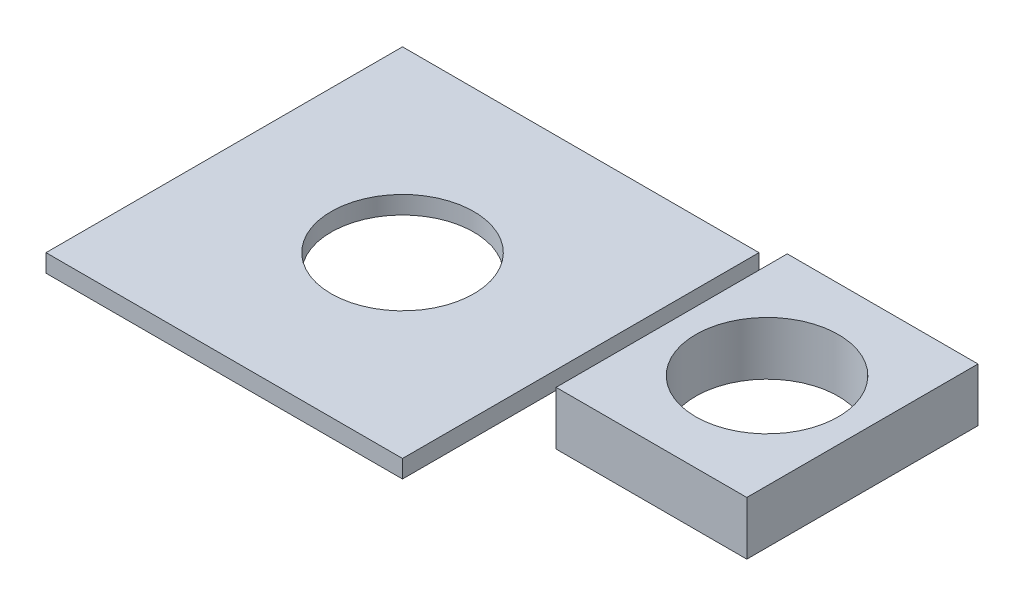
ISO-10303-21;
HEADER;
FILE_DESCRIPTION(('STEP AP214'),'2;1');
FILE_NAME('part.step','',(''),(''),'','','');
FILE_SCHEMA(('AUTOMOTIVE_DESIGN { 1 0 10303 214 1 1 1 1 }'));
ENDSEC;
DATA;
#1=APPLICATION_CONTEXT('core data for automotive mechanical design processes');
#2=APPLICATION_PROTOCOL_DEFINITION('international standard','automotive_design',2000,#1);
#3=PRODUCT_CONTEXT('',#1,'mechanical');
#4=PRODUCT('Part','Part','',(#3));
#5=PRODUCT_RELATED_PRODUCT_CATEGORY('part','',(#4));
#6=PRODUCT_DEFINITION_FORMATION('','',#4);
#7=PRODUCT_DEFINITION_CONTEXT('part definition',#1,'design');
#8=PRODUCT_DEFINITION('design','',#6,#7);
#9=PRODUCT_DEFINITION_SHAPE('','',#8);
#10=(LENGTH_UNIT() NAMED_UNIT(*) SI_UNIT(.MILLI.,.METRE.));
#11=(NAMED_UNIT(*) PLANE_ANGLE_UNIT() SI_UNIT($,.RADIAN.));
#12=(NAMED_UNIT(*) SI_UNIT($,.STERADIAN.) SOLID_ANGLE_UNIT());
#13=UNCERTAINTY_MEASURE_WITH_UNIT(LENGTH_MEASURE(1.E-05),#10,'distance_accuracy_value','');
#14=(GEOMETRIC_REPRESENTATION_CONTEXT(3) GLOBAL_UNCERTAINTY_ASSIGNED_CONTEXT((#13)) GLOBAL_UNIT_ASSIGNED_CONTEXT((#10,
#11,#12)) REPRESENTATION_CONTEXT('',''));
#15=CARTESIAN_POINT('',(0.,0.,0.));
#16=DIRECTION('',(0.,0.,1.));
#17=DIRECTION('',(1.,0.,0.));
#18=AXIS2_PLACEMENT_3D('',#15,#16,#17);
#19=CARTESIAN_POINT('',(0.,1.,0.));
#20=DIRECTION('',(0.,1.,0.));
#21=DIRECTION('',(0.,0.,1.));
#22=AXIS2_PLACEMENT_3D('',#19,#20,#21);
#23=PLANE('',#22);
#24=DIRECTION('',(0.,0.,-1.));
#25=VECTOR('',#24,1.);
#26=CARTESIAN_POINT('',(-8.20172779817295,1.,-7.75070162097188));
#27=LINE('',#26,#25);
#28=CARTESIAN_POINT('',(-8.20172779817295,1.,12.2492983790281));
#29=VERTEX_POINT('',#28);
#30=CARTESIAN_POINT('',(-8.20172779817295,1.,-7.75070162097188));
#31=VERTEX_POINT('',#30);
#32=EDGE_CURVE('E101',#29,#31,#27,.T.);
#33=ORIENTED_EDGE('',*,*,#32,.T.);
#34=DIRECTION('',(-1.,0.,0.));
#35=VECTOR('',#34,1.);
#36=CARTESIAN_POINT('',(-28.201727798173,1.,-7.75070162097188));
#37=LINE('',#36,#35);
#38=CARTESIAN_POINT('',(-28.201727798173,1.,-7.75070162097188));
#39=VERTEX_POINT('',#38);
#40=EDGE_CURVE('E96',#31,#39,#37,.T.);
#41=ORIENTED_EDGE('',*,*,#40,.T.);
#42=DIRECTION('',(0.,0.,1.));
#43=VECTOR('',#42,1.);
#44=CARTESIAN_POINT('',(-28.201727798173,1.,-7.75070162097188));
#45=LINE('',#44,#43);
#46=CARTESIAN_POINT('',(-28.2017277981729,1.,12.2492983790281));
#47=VERTEX_POINT('',#46);
#48=EDGE_CURVE('E99',#39,#47,#45,.T.);
#49=ORIENTED_EDGE('',*,*,#48,.T.);
#50=DIRECTION('',(1.,0.,0.));
#51=VECTOR('',#50,1.);
#52=CARTESIAN_POINT('',(-28.2017277981729,1.,12.2492983790281));
#53=LINE('',#52,#51);
#54=EDGE_CURVE('E66',#47,#29,#53,.T.);
#55=ORIENTED_EDGE('',*,*,#54,.T.);
#56=EDGE_LOOP('',(#33,#41,#49,#55));
#57=FACE_BOUND('',#56,.T.);
#58=CARTESIAN_POINT('',(-18.201727798173,1.,2.24929837902812));
#59=DIRECTION('',(0.,1.,0.));
#60=DIRECTION('',(0.,0.,1.));
#61=AXIS2_PLACEMENT_3D('',#58,#59,#60);
#62=CIRCLE('',#61,4.);
#63=CARTESIAN_POINT('',(-18.201727798173,1.,6.24929837902812));
#64=VERTEX_POINT('',#63);
#65=EDGE_CURVE('E116',#64,#64,#62,.T.);
#66=ORIENTED_EDGE('',*,*,#65,.F.);
#67=EDGE_LOOP('',(#66));
#68=FACE_BOUND('',#67,.T.);
#69=ADVANCED_FACE('F49',(#57,#68),#23,.T.);
#70=CARTESIAN_POINT('',(0.,0.,0.));
#71=DIRECTION('',(0.,1.,0.));
#72=DIRECTION('',(0.,0.,1.));
#73=AXIS2_PLACEMENT_3D('',#70,#71,#72);
#74=PLANE('',#73);
#75=DIRECTION('',(0.,0.,-1.));
#76=VECTOR('',#75,1.);
#77=CARTESIAN_POINT('',(-8.20172779817295,0.,-7.75070162097188));
#78=LINE('',#77,#76);
#79=CARTESIAN_POINT('',(-8.20172779817295,0.,12.2492983790281));
#80=VERTEX_POINT('',#79);
#81=CARTESIAN_POINT('',(-8.20172779817295,0.,-7.75070162097188));
#82=VERTEX_POINT('',#81);
#83=EDGE_CURVE('E113',#80,#82,#78,.T.);
#84=ORIENTED_EDGE('',*,*,#83,.F.);
#85=DIRECTION('',(1.,0.,0.));
#86=VECTOR('',#85,1.);
#87=CARTESIAN_POINT('',(-28.2017277981729,0.,12.2492983790281));
#88=LINE('',#87,#86);
#89=CARTESIAN_POINT('',(-28.2017277981729,0.,12.2492983790281));
#90=VERTEX_POINT('',#89);
#91=EDGE_CURVE('E89',#90,#80,#88,.T.);
#92=ORIENTED_EDGE('',*,*,#91,.F.);
#93=DIRECTION('',(0.,0.,1.));
#94=VECTOR('',#93,1.);
#95=CARTESIAN_POINT('',(-28.201727798173,0.,-7.75070162097188));
#96=LINE('',#95,#94);
#97=CARTESIAN_POINT('',(-28.201727798173,0.,-7.75070162097188));
#98=VERTEX_POINT('',#97);
#99=EDGE_CURVE('E83',#98,#90,#96,.T.);
#100=ORIENTED_EDGE('',*,*,#99,.F.);
#101=DIRECTION('',(-1.,0.,0.));
#102=VECTOR('',#101,1.);
#103=CARTESIAN_POINT('',(-28.201727798173,0.,-7.75070162097188));
#104=LINE('',#103,#102);
#105=EDGE_CURVE('E105',#82,#98,#104,.T.);
#106=ORIENTED_EDGE('',*,*,#105,.F.);
#107=EDGE_LOOP('',(#84,#92,#100,#106));
#108=FACE_BOUND('',#107,.T.);
#109=CARTESIAN_POINT('',(-18.201727798173,0.,2.24929837902812));
#110=DIRECTION('',(0.,1.,0.));
#111=DIRECTION('',(0.,0.,1.));
#112=AXIS2_PLACEMENT_3D('',#109,#110,#111);
#113=CIRCLE('',#112,4.);
#114=CARTESIAN_POINT('',(-18.201727798173,0.,6.24929837902812));
#115=VERTEX_POINT('',#114);
#116=EDGE_CURVE('E128',#115,#115,#113,.T.);
#117=ORIENTED_EDGE('',*,*,#116,.T.);
#118=EDGE_LOOP('',(#117));
#119=FACE_BOUND('',#118,.T.);
#120=ADVANCED_FACE('F124',(#108,#119),#74,.F.);
#121=CARTESIAN_POINT('',(-8.20172779817295,1.,-7.75070162097188));
#122=DIRECTION('',(-1.,0.,0.));
#123=DIRECTION('',(0.,0.,1.));
#124=AXIS2_PLACEMENT_3D('',#121,#122,#123);
#125=PLANE('',#124);
#126=ORIENTED_EDGE('',*,*,#83,.T.);
#127=DIRECTION('',(0.,-1.,0.));
#128=VECTOR('',#127,1.);
#129=CARTESIAN_POINT('',(-8.20172779817295,1.,-7.75070162097188));
#130=LINE('',#129,#128);
#131=EDGE_CURVE('E12',#31,#82,#130,.T.);
#132=ORIENTED_EDGE('',*,*,#131,.F.);
#133=ORIENTED_EDGE('',*,*,#32,.F.);
#134=DIRECTION('',(0.,-1.,0.));
#135=VECTOR('',#134,1.);
#136=CARTESIAN_POINT('',(-8.20172779817295,1.,12.2492983790281));
#137=LINE('',#136,#135);
#138=EDGE_CURVE('E109',#29,#80,#137,.T.);
#139=ORIENTED_EDGE('',*,*,#138,.T.);
#140=EDGE_LOOP('',(#126,#132,#133,#139));
#141=FACE_BOUND('',#140,.T.);
#142=ADVANCED_FACE('F51',(#141),#125,.F.);
#143=CARTESIAN_POINT('',(-28.201727798173,1.,-7.75070162097188));
#144=DIRECTION('',(0.,0.,1.));
#145=DIRECTION('',(1.,0.,0.));
#146=AXIS2_PLACEMENT_3D('',#143,#144,#145);
#147=PLANE('',#146);
#148=ORIENTED_EDGE('',*,*,#105,.T.);
#149=DIRECTION('',(0.,-1.,0.));
#150=VECTOR('',#149,1.);
#151=CARTESIAN_POINT('',(-28.201727798173,1.,-7.75070162097188));
#152=LINE('',#151,#150);
#153=EDGE_CURVE('E58',#39,#98,#152,.T.);
#154=ORIENTED_EDGE('',*,*,#153,.F.);
#155=ORIENTED_EDGE('',*,*,#40,.F.);
#156=ORIENTED_EDGE('',*,*,#131,.T.);
#157=EDGE_LOOP('',(#148,#154,#155,#156));
#158=FACE_BOUND('',#157,.T.);
#159=ADVANCED_FACE('F104',(#158),#147,.F.);
#160=CARTESIAN_POINT('',(-28.201727798173,1.,-7.75070162097188));
#161=DIRECTION('',(1.,0.,0.));
#162=DIRECTION('',(0.,0.,-1.));
#163=AXIS2_PLACEMENT_3D('',#160,#161,#162);
#164=PLANE('',#163);
#165=ORIENTED_EDGE('',*,*,#99,.T.);
#166=DIRECTION('',(0.,-1.,0.));
#167=VECTOR('',#166,1.);
#168=CARTESIAN_POINT('',(-28.2017277981729,1.,12.2492983790281));
#169=LINE('',#168,#167);
#170=EDGE_CURVE('E106',#47,#90,#169,.T.);
#171=ORIENTED_EDGE('',*,*,#170,.F.);
#172=ORIENTED_EDGE('',*,*,#48,.F.);
#173=ORIENTED_EDGE('',*,*,#153,.T.);
#174=EDGE_LOOP('',(#165,#171,#172,#173));
#175=FACE_BOUND('',#174,.T.);
#176=ADVANCED_FACE('F107',(#175),#164,.F.);
#177=CARTESIAN_POINT('',(-28.2017277981729,1.,12.2492983790281));
#178=DIRECTION('',(0.,0.,-1.));
#179=DIRECTION('',(-1.,0.,0.));
#180=AXIS2_PLACEMENT_3D('',#177,#178,#179);
#181=PLANE('',#180);
#182=ORIENTED_EDGE('',*,*,#91,.T.);
#183=ORIENTED_EDGE('',*,*,#138,.F.);
#184=ORIENTED_EDGE('',*,*,#54,.F.);
#185=ORIENTED_EDGE('',*,*,#170,.T.);
#186=EDGE_LOOP('',(#182,#183,#184,#185));
#187=FACE_BOUND('',#186,.T.);
#188=ADVANCED_FACE('F121',(#187),#181,.F.);
#189=CARTESIAN_POINT('',(-18.201727798173,1.,2.24929837902812));
#190=DIRECTION('',(0.,-1.,0.));
#191=DIRECTION('',(0.,0.,-1.));
#192=AXIS2_PLACEMENT_3D('',#189,#190,#191);
#193=CYLINDRICAL_SURFACE('',#192,4.);
#194=ORIENTED_EDGE('',*,*,#65,.T.);
#195=EDGE_LOOP('',(#194));
#196=FACE_BOUND('',#195,.T.);
#197=ORIENTED_EDGE('',*,*,#116,.F.);
#198=EDGE_LOOP('',(#197));
#199=FACE_BOUND('',#198,.T.);
#200=ADVANCED_FACE('F134',(#196,#199),#193,.F.);
#201=CLOSED_SHELL('',(#69,#120,#142,#159,#176,#188,#200));
#202=MANIFOLD_SOLID_BREP('B2',#201);
#203=CARTESIAN_POINT('',(0.,3.,0.));
#204=DIRECTION('',(0.,-1.,0.));
#205=DIRECTION('',(0.,0.,-1.));
#206=AXIS2_PLACEMENT_3D('',#203,#204,#205);
#207=PLANE('',#206);
#208=DIRECTION('',(0.,0.,-1.));
#209=VECTOR('',#208,1.);
#210=CARTESIAN_POINT('',(5.35,3.,6.485));
#211=LINE('',#210,#209);
#212=CARTESIAN_POINT('',(5.35,3.,6.485));
#213=VERTEX_POINT('',#212);
#214=CARTESIAN_POINT('',(5.35,3.,-6.485));
#215=VERTEX_POINT('',#214);
#216=EDGE_CURVE('E260',#213,#215,#211,.T.);
#217=ORIENTED_EDGE('',*,*,#216,.T.);
#218=DIRECTION('',(-1.,0.,0.));
#219=VECTOR('',#218,1.);
#220=CARTESIAN_POINT('',(-5.35,3.,-6.485));
#221=LINE('',#220,#219);
#222=CARTESIAN_POINT('',(-5.35,3.,-6.485));
#223=VERTEX_POINT('',#222);
#224=EDGE_CURVE('E255',#215,#223,#221,.T.);
#225=ORIENTED_EDGE('',*,*,#224,.T.);
#226=DIRECTION('',(0.,0.,1.));
#227=VECTOR('',#226,1.);
#228=CARTESIAN_POINT('',(-5.35,3.,6.485));
#229=LINE('',#228,#227);
#230=CARTESIAN_POINT('',(-5.35,3.,6.485));
#231=VERTEX_POINT('',#230);
#232=EDGE_CURVE('E258',#223,#231,#229,.T.);
#233=ORIENTED_EDGE('',*,*,#232,.T.);
#234=DIRECTION('',(1.,0.,0.));
#235=VECTOR('',#234,1.);
#236=CARTESIAN_POINT('',(-5.35,3.,6.485));
#237=LINE('',#236,#235);
#238=EDGE_CURVE('E225',#231,#213,#237,.T.);
#239=ORIENTED_EDGE('',*,*,#238,.T.);
#240=EDGE_LOOP('',(#217,#225,#233,#239));
#241=FACE_BOUND('',#240,.T.);
#242=CARTESIAN_POINT('',(0.,3.,0.));
#243=DIRECTION('',(0.,1.,0.));
#244=DIRECTION('',(0.,0.,1.));
#245=AXIS2_PLACEMENT_3D('',#242,#243,#244);
#246=CIRCLE('',#245,4.);
#247=CARTESIAN_POINT('',(0.,3.,4.));
#248=VERTEX_POINT('',#247);
#249=EDGE_CURVE('E275',#248,#248,#246,.T.);
#250=ORIENTED_EDGE('',*,*,#249,.F.);
#251=EDGE_LOOP('',(#250));
#252=FACE_BOUND('',#251,.T.);
#253=ADVANCED_FACE('F208',(#241,#252),#207,.F.);
#254=CARTESIAN_POINT('',(0.,0.,0.));
#255=DIRECTION('',(0.,-1.,0.));
#256=DIRECTION('',(0.,0.,-1.));
#257=AXIS2_PLACEMENT_3D('',#254,#255,#256);
#258=PLANE('',#257);
#259=DIRECTION('',(0.,0.,-1.));
#260=VECTOR('',#259,1.);
#261=CARTESIAN_POINT('',(5.35,0.,6.485));
#262=LINE('',#261,#260);
#263=CARTESIAN_POINT('',(5.35,0.,6.485));
#264=VERTEX_POINT('',#263);
#265=CARTESIAN_POINT('',(5.35,0.,-6.485));
#266=VERTEX_POINT('',#265);
#267=EDGE_CURVE('E272',#264,#266,#262,.T.);
#268=ORIENTED_EDGE('',*,*,#267,.F.);
#269=DIRECTION('',(1.,0.,0.));
#270=VECTOR('',#269,1.);
#271=CARTESIAN_POINT('',(-5.35,0.,6.485));
#272=LINE('',#271,#270);
#273=CARTESIAN_POINT('',(-5.35,0.,6.485));
#274=VERTEX_POINT('',#273);
#275=EDGE_CURVE('E248',#274,#264,#272,.T.);
#276=ORIENTED_EDGE('',*,*,#275,.F.);
#277=DIRECTION('',(0.,0.,1.));
#278=VECTOR('',#277,1.);
#279=CARTESIAN_POINT('',(-5.35,0.,6.485));
#280=LINE('',#279,#278);
#281=CARTESIAN_POINT('',(-5.35,0.,-6.485));
#282=VERTEX_POINT('',#281);
#283=EDGE_CURVE('E242',#282,#274,#280,.T.);
#284=ORIENTED_EDGE('',*,*,#283,.F.);
#285=DIRECTION('',(-1.,0.,0.));
#286=VECTOR('',#285,1.);
#287=CARTESIAN_POINT('',(-5.35,0.,-6.485));
#288=LINE('',#287,#286);
#289=EDGE_CURVE('E264',#266,#282,#288,.T.);
#290=ORIENTED_EDGE('',*,*,#289,.F.);
#291=EDGE_LOOP('',(#268,#276,#284,#290));
#292=FACE_BOUND('',#291,.T.);
#293=CARTESIAN_POINT('',(0.,0.,0.));
#294=DIRECTION('',(0.,1.,0.));
#295=DIRECTION('',(0.,0.,1.));
#296=AXIS2_PLACEMENT_3D('',#293,#294,#295);
#297=CIRCLE('',#296,4.);
#298=CARTESIAN_POINT('',(0.,0.,4.));
#299=VERTEX_POINT('',#298);
#300=EDGE_CURVE('E287',#299,#299,#297,.T.);
#301=ORIENTED_EDGE('',*,*,#300,.T.);
#302=EDGE_LOOP('',(#301));
#303=FACE_BOUND('',#302,.T.);
#304=ADVANCED_FACE('F283',(#292,#303),#258,.T.);
#305=CARTESIAN_POINT('',(5.35,3.,6.485));
#306=DIRECTION('',(-1.,0.,0.));
#307=DIRECTION('',(0.,0.,1.));
#308=AXIS2_PLACEMENT_3D('',#305,#306,#307);
#309=PLANE('',#308);
#310=ORIENTED_EDGE('',*,*,#267,.T.);
#311=DIRECTION('',(0.,-1.,0.));
#312=VECTOR('',#311,1.);
#313=CARTESIAN_POINT('',(5.35,3.,-6.485));
#314=LINE('',#313,#312);
#315=EDGE_CURVE('E47',#215,#266,#314,.T.);
#316=ORIENTED_EDGE('',*,*,#315,.F.);
#317=ORIENTED_EDGE('',*,*,#216,.F.);
#318=DIRECTION('',(0.,-1.,0.));
#319=VECTOR('',#318,1.);
#320=CARTESIAN_POINT('',(5.35,3.,6.485));
#321=LINE('',#320,#319);
#322=EDGE_CURVE('E268',#213,#264,#321,.T.);
#323=ORIENTED_EDGE('',*,*,#322,.T.);
#324=EDGE_LOOP('',(#310,#316,#317,#323));
#325=FACE_BOUND('',#324,.T.);
#326=ADVANCED_FACE('F210',(#325),#309,.F.);
#327=CARTESIAN_POINT('',(-5.35,3.,-6.485));
#328=DIRECTION('',(0.,0.,1.));
#329=DIRECTION('',(1.,0.,0.));
#330=AXIS2_PLACEMENT_3D('',#327,#328,#329);
#331=PLANE('',#330);
#332=ORIENTED_EDGE('',*,*,#289,.T.);
#333=DIRECTION('',(0.,-1.,0.));
#334=VECTOR('',#333,1.);
#335=CARTESIAN_POINT('',(-5.35,3.,-6.485));
#336=LINE('',#335,#334);
#337=EDGE_CURVE('E217',#223,#282,#336,.T.);
#338=ORIENTED_EDGE('',*,*,#337,.F.);
#339=ORIENTED_EDGE('',*,*,#224,.F.);
#340=ORIENTED_EDGE('',*,*,#315,.T.);
#341=EDGE_LOOP('',(#332,#338,#339,#340));
#342=FACE_BOUND('',#341,.T.);
#343=ADVANCED_FACE('F263',(#342),#331,.F.);
#344=CARTESIAN_POINT('',(-5.35,3.,6.485));
#345=DIRECTION('',(1.,0.,0.));
#346=DIRECTION('',(0.,0.,-1.));
#347=AXIS2_PLACEMENT_3D('',#344,#345,#346);
#348=PLANE('',#347);
#349=ORIENTED_EDGE('',*,*,#283,.T.);
#350=DIRECTION('',(0.,-1.,0.));
#351=VECTOR('',#350,1.);
#352=CARTESIAN_POINT('',(-5.35,3.,6.485));
#353=LINE('',#352,#351);
#354=EDGE_CURVE('E265',#231,#274,#353,.T.);
#355=ORIENTED_EDGE('',*,*,#354,.F.);
#356=ORIENTED_EDGE('',*,*,#232,.F.);
#357=ORIENTED_EDGE('',*,*,#337,.T.);
#358=EDGE_LOOP('',(#349,#355,#356,#357));
#359=FACE_BOUND('',#358,.T.);
#360=ADVANCED_FACE('F266',(#359),#348,.F.);
#361=CARTESIAN_POINT('',(-5.35,3.,6.485));
#362=DIRECTION('',(0.,0.,-1.));
#363=DIRECTION('',(-1.,0.,0.));
#364=AXIS2_PLACEMENT_3D('',#361,#362,#363);
#365=PLANE('',#364);
#366=ORIENTED_EDGE('',*,*,#275,.T.);
#367=ORIENTED_EDGE('',*,*,#322,.F.);
#368=ORIENTED_EDGE('',*,*,#238,.F.);
#369=ORIENTED_EDGE('',*,*,#354,.T.);
#370=EDGE_LOOP('',(#366,#367,#368,#369));
#371=FACE_BOUND('',#370,.T.);
#372=ADVANCED_FACE('F280',(#371),#365,.F.);
#373=CARTESIAN_POINT('',(0.,3.,0.));
#374=DIRECTION('',(0.,-1.,0.));
#375=DIRECTION('',(0.,0.,-1.));
#376=AXIS2_PLACEMENT_3D('',#373,#374,#375);
#377=CYLINDRICAL_SURFACE('',#376,4.);
#378=ORIENTED_EDGE('',*,*,#249,.T.);
#379=EDGE_LOOP('',(#378));
#380=FACE_BOUND('',#379,.T.);
#381=ORIENTED_EDGE('',*,*,#300,.F.);
#382=EDGE_LOOP('',(#381));
#383=FACE_BOUND('',#382,.T.);
#384=ADVANCED_FACE('F293',(#380,#383),#377,.F.);
#385=CLOSED_SHELL('',(#253,#304,#326,#343,#360,#372,#384));
#386=MANIFOLD_SOLID_BREP('B6',#385);
#387=ADVANCED_BREP_SHAPE_REPRESENTATION('',(#18,#202,#386),#14);
#388=SHAPE_DEFINITION_REPRESENTATION(#9,#387);
ENDSEC;
END-ISO-10303-21;
